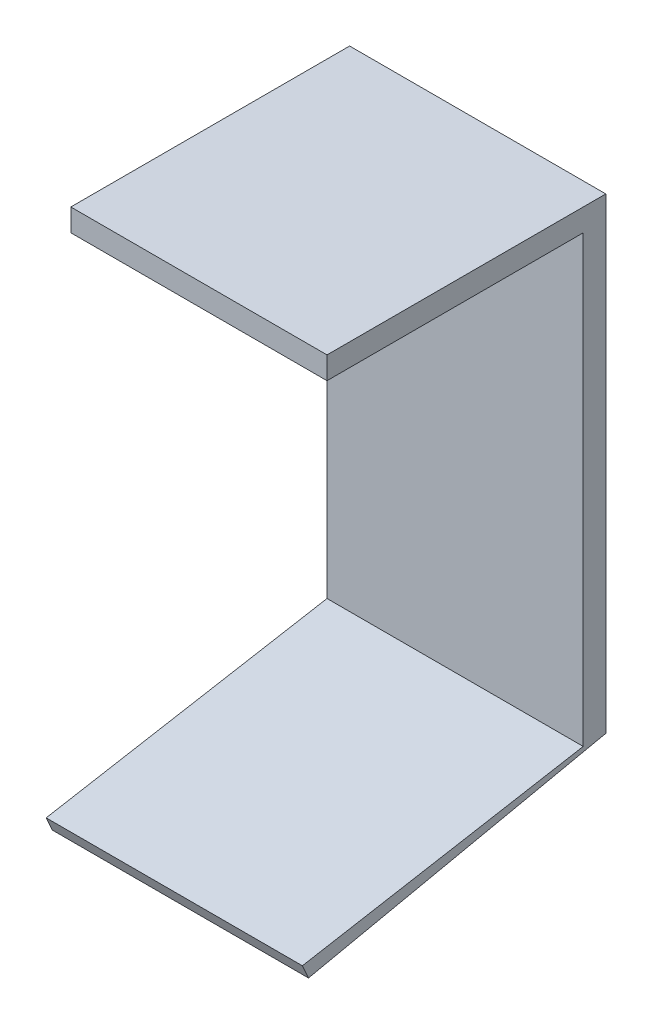
ISO-10303-21;
HEADER;
FILE_DESCRIPTION(('STEP AP214'),'2;1');
FILE_NAME('part.step','',(''),(''),'','','');
FILE_SCHEMA(('AUTOMOTIVE_DESIGN { 1 0 10303 214 1 1 1 1 }'));
ENDSEC;
DATA;
#1=APPLICATION_CONTEXT('core data for automotive mechanical design processes');
#2=APPLICATION_PROTOCOL_DEFINITION('international standard','automotive_design',2000,#1);
#3=PRODUCT_CONTEXT('',#1,'mechanical');
#4=PRODUCT('Part','Part','',(#3));
#5=PRODUCT_RELATED_PRODUCT_CATEGORY('part','',(#4));
#6=PRODUCT_DEFINITION_FORMATION('','',#4);
#7=PRODUCT_DEFINITION_CONTEXT('part definition',#1,'design');
#8=PRODUCT_DEFINITION('design','',#6,#7);
#9=PRODUCT_DEFINITION_SHAPE('','',#8);
#10=(LENGTH_UNIT() NAMED_UNIT(*) SI_UNIT(.MILLI.,.METRE.));
#11=(NAMED_UNIT(*) PLANE_ANGLE_UNIT() SI_UNIT($,.RADIAN.));
#12=(NAMED_UNIT(*) SI_UNIT($,.STERADIAN.) SOLID_ANGLE_UNIT());
#13=UNCERTAINTY_MEASURE_WITH_UNIT(LENGTH_MEASURE(1.E-05),#10,'distance_accuracy_value','');
#14=(GEOMETRIC_REPRESENTATION_CONTEXT(3) GLOBAL_UNCERTAINTY_ASSIGNED_CONTEXT((#13)) GLOBAL_UNIT_ASSIGNED_CONTEXT((#10,
#11,#12)) REPRESENTATION_CONTEXT('',''));
#15=CARTESIAN_POINT('',(0.,0.,0.));
#16=DIRECTION('',(0.,0.,1.));
#17=DIRECTION('',(1.,0.,0.));
#18=AXIS2_PLACEMENT_3D('',#15,#16,#17);
#19=CARTESIAN_POINT('',(0.,124.,0.));
#20=DIRECTION('',(0.,0.,-1.));
#21=DIRECTION('',(-1.,0.,0.));
#22=AXIS2_PLACEMENT_3D('',#19,#20,#21);
#23=PLANE('',#22);
#24=DIRECTION('',(1.,0.,0.));
#25=VECTOR('',#24,1.);
#26=CARTESIAN_POINT('',(68.,118.06360543963,0.));
#27=LINE('',#26,#25);
#28=CARTESIAN_POINT('',(0.,118.06360543963,0.));
#29=VERTEX_POINT('',#28);
#30=CARTESIAN_POINT('',(68.,118.06360543963,0.));
#31=VERTEX_POINT('',#30);
#32=EDGE_CURVE('E114',#29,#31,#27,.T.);
#33=ORIENTED_EDGE('',*,*,#32,.F.);
#34=DIRECTION('',(0.,-1.,0.));
#35=VECTOR('',#34,1.);
#36=CARTESIAN_POINT('',(0.,124.,0.));
#37=LINE('',#36,#35);
#38=CARTESIAN_POINT('',(0.,0.,0.));
#39=VERTEX_POINT('',#38);
#40=EDGE_CURVE('E11',#29,#39,#37,.T.);
#41=ORIENTED_EDGE('',*,*,#40,.T.);
#42=DIRECTION('',(1.,0.,0.));
#43=VECTOR('',#42,1.);
#44=CARTESIAN_POINT('',(0.,0.,0.));
#45=LINE('',#44,#43);
#46=CARTESIAN_POINT('',(68.,0.,0.));
#47=VERTEX_POINT('',#46);
#48=EDGE_CURVE('E142',#39,#47,#45,.T.);
#49=ORIENTED_EDGE('',*,*,#48,.T.);
#50=DIRECTION('',(0.,-1.,0.));
#51=VECTOR('',#50,1.);
#52=CARTESIAN_POINT('',(68.,124.,0.));
#53=LINE('',#52,#51);
#54=EDGE_CURVE('E42',#31,#47,#53,.T.);
#55=ORIENTED_EDGE('',*,*,#54,.F.);
#56=EDGE_LOOP('',(#33,#41,#49,#55));
#57=FACE_BOUND('',#56,.T.);
#58=ADVANCED_FACE('F33',(#57),#23,.F.);
#59=CARTESIAN_POINT('',(0.,124.,0.));
#60=DIRECTION('',(1.,0.,0.));
#61=DIRECTION('',(0.,0.,-1.));
#62=AXIS2_PLACEMENT_3D('',#59,#60,#61);
#63=PLANE('',#62);
#64=DIRECTION('',(0.,-1.,0.));
#65=VECTOR('',#64,1.);
#66=CARTESIAN_POINT('',(0.,124.,-6.));
#67=LINE('',#66,#65);
#68=CARTESIAN_POINT('',(0.,124.,-6.));
#69=VERTEX_POINT('',#68);
#70=CARTESIAN_POINT('',(0.,0.,-6.));
#71=VERTEX_POINT('',#70);
#72=EDGE_CURVE('E146',#69,#71,#67,.T.);
#73=ORIENTED_EDGE('',*,*,#72,.T.);
#74=DIRECTION('',(0.,0.207911690817753,-0.978147600733807));
#75=VECTOR('',#74,1.);
#76=CARTESIAN_POINT('',(0.,0.,-6.));
#77=LINE('',#76,#75);
#78=CARTESIAN_POINT('',(0.,-16.7730927404857,72.911197135966));
#79=VERTEX_POINT('',#78);
#80=EDGE_CURVE('E128',#79,#71,#77,.T.);
#81=ORIENTED_EDGE('',*,*,#80,.F.);
#82=DIRECTION('',(0.,-0.912697043848787,-0.408636887896438));
#83=VECTOR('',#82,1.);
#84=CARTESIAN_POINT('',(0.,-16.7730927404857,72.911197135966));
#85=LINE('',#84,#83);
#86=CARTESIAN_POINT('',(0.,-13.142807465097,74.5365650355435));
#87=VERTEX_POINT('',#86);
#88=EDGE_CURVE('E134',#87,#79,#85,.T.);
#89=ORIENTED_EDGE('',*,*,#88,.F.);
#90=DIRECTION('',(0.,-0.173648177666924,0.984807753012209));
#91=VECTOR('',#90,1.);
#92=CARTESIAN_POINT('',(0.,0.,0.));
#93=LINE('',#92,#91);
#94=EDGE_CURVE('E124',#39,#87,#93,.T.);
#95=ORIENTED_EDGE('',*,*,#94,.F.);
#96=ORIENTED_EDGE('',*,*,#40,.F.);
#97=DIRECTION('',(0.,0.,-1.));
#98=VECTOR('',#97,1.);
#99=CARTESIAN_POINT('',(0.,118.06360543963,68.));
#100=LINE('',#99,#98);
#101=CARTESIAN_POINT('',(0.,118.06360543963,68.));
#102=VERTEX_POINT('',#101);
#103=EDGE_CURVE('E122',#102,#29,#100,.T.);
#104=ORIENTED_EDGE('',*,*,#103,.F.);
#105=DIRECTION('',(0.,-1.,0.));
#106=VECTOR('',#105,1.);
#107=CARTESIAN_POINT('',(0.,118.06360543963,68.));
#108=LINE('',#107,#106);
#109=CARTESIAN_POINT('',(0.,124.,68.));
#110=VERTEX_POINT('',#109);
#111=EDGE_CURVE('E108',#110,#102,#108,.T.);
#112=ORIENTED_EDGE('',*,*,#111,.F.);
#113=DIRECTION('',(0.,0.,1.));
#114=VECTOR('',#113,1.);
#115=CARTESIAN_POINT('',(0.,124.,0.));
#116=LINE('',#115,#114);
#117=EDGE_CURVE('E100',#69,#110,#116,.T.);
#118=ORIENTED_EDGE('',*,*,#117,.F.);
#119=EDGE_LOOP('',(#73,#81,#89,#95,#96,#104,#112,#118));
#120=FACE_BOUND('',#119,.T.);
#121=ADVANCED_FACE('F35',(#120),#63,.F.);
#122=CARTESIAN_POINT('',(68.,124.,0.));
#123=DIRECTION('',(-1.,0.,0.));
#124=DIRECTION('',(0.,0.,1.));
#125=AXIS2_PLACEMENT_3D('',#122,#123,#124);
#126=PLANE('',#125);
#127=DIRECTION('',(0.,0.,-1.));
#128=VECTOR('',#127,1.);
#129=CARTESIAN_POINT('',(68.,124.,0.));
#130=LINE('',#129,#128);
#131=CARTESIAN_POINT('',(68.,124.,68.));
#132=VERTEX_POINT('',#131);
#133=CARTESIAN_POINT('',(68.,124.,-6.));
#134=VERTEX_POINT('',#133);
#135=EDGE_CURVE('E92',#132,#134,#130,.T.);
#136=ORIENTED_EDGE('',*,*,#135,.F.);
#137=DIRECTION('',(0.,1.,0.));
#138=VECTOR('',#137,1.);
#139=CARTESIAN_POINT('',(68.,118.06360543963,68.));
#140=LINE('',#139,#138);
#141=CARTESIAN_POINT('',(68.,118.06360543963,68.));
#142=VERTEX_POINT('',#141);
#143=EDGE_CURVE('E97',#142,#132,#140,.T.);
#144=ORIENTED_EDGE('',*,*,#143,.F.);
#145=DIRECTION('',(0.,0.,-1.));
#146=VECTOR('',#145,1.);
#147=CARTESIAN_POINT('',(68.,118.06360543963,68.));
#148=LINE('',#147,#146);
#149=EDGE_CURVE('E119',#142,#31,#148,.T.);
#150=ORIENTED_EDGE('',*,*,#149,.T.);
#151=ORIENTED_EDGE('',*,*,#54,.T.);
#152=DIRECTION('',(0.,-0.173648177666924,0.984807753012209));
#153=VECTOR('',#152,1.);
#154=CARTESIAN_POINT('',(68.,0.,0.));
#155=LINE('',#154,#153);
#156=CARTESIAN_POINT('',(68.,-13.142807465097,74.5365650355435));
#157=VERTEX_POINT('',#156);
#158=EDGE_CURVE('E125',#47,#157,#155,.T.);
#159=ORIENTED_EDGE('',*,*,#158,.T.);
#160=DIRECTION('',(0.,-0.912697043848787,-0.408636887896438));
#161=VECTOR('',#160,1.);
#162=CARTESIAN_POINT('',(68.,-16.7730927404857,72.911197135966));
#163=LINE('',#162,#161);
#164=CARTESIAN_POINT('',(68.,-16.7730927404857,72.911197135966));
#165=VERTEX_POINT('',#164);
#166=EDGE_CURVE('E127',#157,#165,#163,.T.);
#167=ORIENTED_EDGE('',*,*,#166,.T.);
#168=DIRECTION('',(0.,0.207911690817753,-0.978147600733807));
#169=VECTOR('',#168,1.);
#170=CARTESIAN_POINT('',(68.,0.,-6.));
#171=LINE('',#170,#169);
#172=CARTESIAN_POINT('',(68.,0.,-6.));
#173=VERTEX_POINT('',#172);
#174=EDGE_CURVE('E130',#165,#173,#171,.T.);
#175=ORIENTED_EDGE('',*,*,#174,.T.);
#176=DIRECTION('',(0.,-1.,0.));
#177=VECTOR('',#176,1.);
#178=CARTESIAN_POINT('',(68.,124.,-6.));
#179=LINE('',#178,#177);
#180=EDGE_CURVE('E99',#134,#173,#179,.T.);
#181=ORIENTED_EDGE('',*,*,#180,.F.);
#182=EDGE_LOOP('',(#136,#144,#150,#151,#159,#167,#175,#181));
#183=FACE_BOUND('',#182,.T.);
#184=ADVANCED_FACE('F94',(#183),#126,.F.);
#185=CARTESIAN_POINT('',(0.,124.,-6.));
#186=DIRECTION('',(0.,0.,1.));
#187=DIRECTION('',(1.,0.,0.));
#188=AXIS2_PLACEMENT_3D('',#185,#186,#187);
#189=PLANE('',#188);
#190=DIRECTION('',(-1.,0.,0.));
#191=VECTOR('',#190,1.);
#192=CARTESIAN_POINT('',(0.,0.,-6.));
#193=LINE('',#192,#191);
#194=EDGE_CURVE('E143',#173,#71,#193,.T.);
#195=ORIENTED_EDGE('',*,*,#194,.T.);
#196=ORIENTED_EDGE('',*,*,#72,.F.);
#197=DIRECTION('',(-1.,0.,0.));
#198=VECTOR('',#197,1.);
#199=CARTESIAN_POINT('',(0.,124.,-6.));
#200=LINE('',#199,#198);
#201=EDGE_CURVE('E49',#134,#69,#200,.T.);
#202=ORIENTED_EDGE('',*,*,#201,.F.);
#203=ORIENTED_EDGE('',*,*,#180,.T.);
#204=EDGE_LOOP('',(#195,#196,#202,#203));
#205=FACE_BOUND('',#204,.T.);
#206=ADVANCED_FACE('F177',(#205),#189,.F.);
#207=CARTESIAN_POINT('',(0.,124.,0.));
#208=DIRECTION('',(0.,-1.,0.));
#209=DIRECTION('',(0.,0.,-1.));
#210=AXIS2_PLACEMENT_3D('',#207,#208,#209);
#211=PLANE('',#210);
#212=ORIENTED_EDGE('',*,*,#117,.T.);
#213=DIRECTION('',(-1.,0.,0.));
#214=VECTOR('',#213,1.);
#215=CARTESIAN_POINT('',(68.,124.,68.));
#216=LINE('',#215,#214);
#217=EDGE_CURVE('E103',#132,#110,#216,.T.);
#218=ORIENTED_EDGE('',*,*,#217,.F.);
#219=ORIENTED_EDGE('',*,*,#135,.T.);
#220=ORIENTED_EDGE('',*,*,#201,.T.);
#221=EDGE_LOOP('',(#212,#218,#219,#220));
#222=FACE_BOUND('',#221,.T.);
#223=ADVANCED_FACE('F104',(#222),#211,.F.);
#224=CARTESIAN_POINT('',(68.,0.,0.));
#225=DIRECTION('',(0.,-0.984807753012209,-0.173648177666924));
#226=DIRECTION('',(0.,0.173648177666924,-0.984807753012209));
#227=AXIS2_PLACEMENT_3D('',#224,#225,#226);
#228=PLANE('',#227);
#229=ORIENTED_EDGE('',*,*,#94,.T.);
#230=DIRECTION('',(-1.,0.,0.));
#231=VECTOR('',#230,1.);
#232=CARTESIAN_POINT('',(68.,-13.142807465097,74.5365650355435));
#233=LINE('',#232,#231);
#234=EDGE_CURVE('E139',#157,#87,#233,.T.);
#235=ORIENTED_EDGE('',*,*,#234,.F.);
#236=ORIENTED_EDGE('',*,*,#158,.F.);
#237=ORIENTED_EDGE('',*,*,#48,.F.);
#238=EDGE_LOOP('',(#229,#235,#236,#237));
#239=FACE_BOUND('',#238,.T.);
#240=ADVANCED_FACE('F161',(#239),#228,.F.);
#241=CARTESIAN_POINT('',(68.,-16.7730927404857,72.911197135966));
#242=DIRECTION('',(0.,0.408636887896438,-0.912697043848787));
#243=DIRECTION('',(0.,0.912697043848787,0.408636887896438));
#244=AXIS2_PLACEMENT_3D('',#241,#242,#243);
#245=PLANE('',#244);
#246=ORIENTED_EDGE('',*,*,#88,.T.);
#247=DIRECTION('',(-1.,0.,0.));
#248=VECTOR('',#247,1.);
#249=CARTESIAN_POINT('',(68.,-16.7730927404857,72.911197135966));
#250=LINE('',#249,#248);
#251=EDGE_CURVE('E132',#165,#79,#250,.T.);
#252=ORIENTED_EDGE('',*,*,#251,.F.);
#253=ORIENTED_EDGE('',*,*,#166,.F.);
#254=ORIENTED_EDGE('',*,*,#234,.T.);
#255=EDGE_LOOP('',(#246,#252,#253,#254));
#256=FACE_BOUND('',#255,.T.);
#257=ADVANCED_FACE('F170',(#256),#245,.F.);
#258=CARTESIAN_POINT('',(68.,0.,-6.));
#259=DIRECTION('',(0.,0.978147600733807,0.207911690817753));
#260=DIRECTION('',(0.,-0.207911690817753,0.978147600733807));
#261=AXIS2_PLACEMENT_3D('',#258,#259,#260);
#262=PLANE('',#261);
#263=ORIENTED_EDGE('',*,*,#80,.T.);
#264=ORIENTED_EDGE('',*,*,#194,.F.);
#265=ORIENTED_EDGE('',*,*,#174,.F.);
#266=ORIENTED_EDGE('',*,*,#251,.T.);
#267=EDGE_LOOP('',(#263,#264,#265,#266));
#268=FACE_BOUND('',#267,.T.);
#269=ADVANCED_FACE('F175',(#268),#262,.F.);
#270=CARTESIAN_POINT('',(68.,118.06360543963,68.));
#271=DIRECTION('',(0.,1.,0.));
#272=DIRECTION('',(0.,0.,1.));
#273=AXIS2_PLACEMENT_3D('',#270,#271,#272);
#274=PLANE('',#273);
#275=ORIENTED_EDGE('',*,*,#32,.T.);
#276=ORIENTED_EDGE('',*,*,#149,.F.);
#277=DIRECTION('',(1.,0.,0.));
#278=VECTOR('',#277,1.);
#279=CARTESIAN_POINT('',(68.,118.06360543963,68.));
#280=LINE('',#279,#278);
#281=EDGE_CURVE('E112',#102,#142,#280,.T.);
#282=ORIENTED_EDGE('',*,*,#281,.F.);
#283=ORIENTED_EDGE('',*,*,#103,.T.);
#284=EDGE_LOOP('',(#275,#276,#282,#283));
#285=FACE_BOUND('',#284,.T.);
#286=ADVANCED_FACE('F179',(#285),#274,.F.);
#287=CARTESIAN_POINT('',(0.,0.,68.));
#288=DIRECTION('',(0.,0.,1.));
#289=DIRECTION('',(1.,0.,0.));
#290=AXIS2_PLACEMENT_3D('',#287,#288,#289);
#291=PLANE('',#290);
#292=ORIENTED_EDGE('',*,*,#143,.T.);
#293=ORIENTED_EDGE('',*,*,#217,.T.);
#294=ORIENTED_EDGE('',*,*,#111,.T.);
#295=ORIENTED_EDGE('',*,*,#281,.T.);
#296=EDGE_LOOP('',(#292,#293,#294,#295));
#297=FACE_BOUND('',#296,.T.);
#298=ADVANCED_FACE('F110',(#297),#291,.T.);
#299=CLOSED_SHELL('',(#58,#121,#184,#206,#223,#240,#257,#269,#286,#298));
#300=MANIFOLD_SOLID_BREP('B2',#299);
#301=ADVANCED_BREP_SHAPE_REPRESENTATION('',(#18,#300),#14);
#302=SHAPE_DEFINITION_REPRESENTATION(#9,#301);
ENDSEC;
END-ISO-10303-21;
